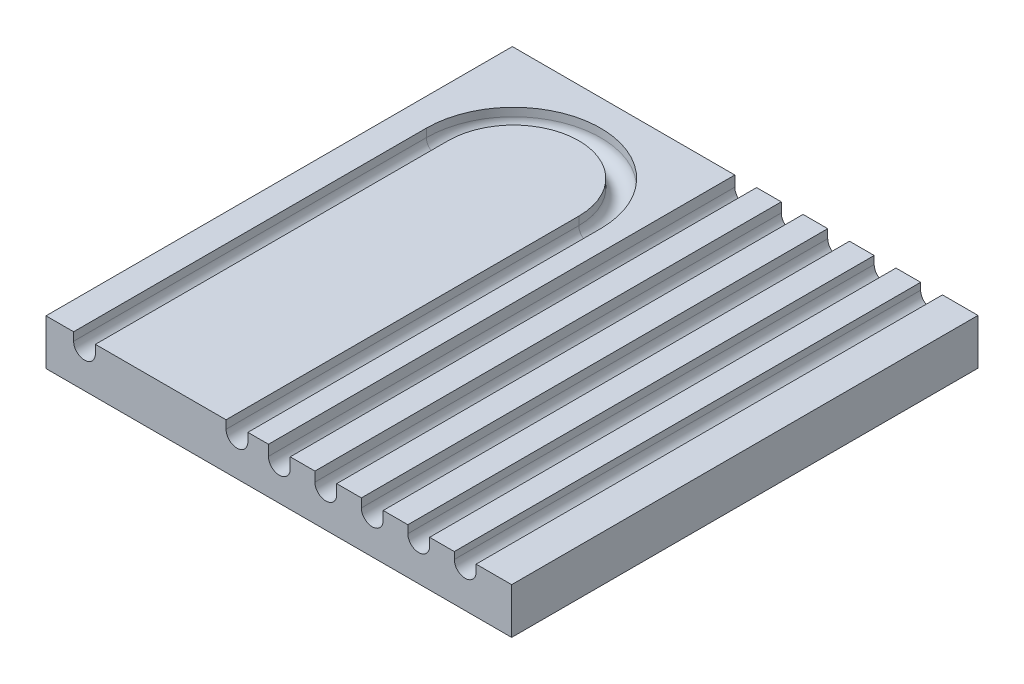
ISO-10303-21;
HEADER;
FILE_DESCRIPTION(('STEP AP214'),'2;1');
FILE_NAME('part.step','',(''),(''),'','','');
FILE_SCHEMA(('AUTOMOTIVE_DESIGN { 1 0 10303 214 1 1 1 1 }'));
ENDSEC;
DATA;
#1=APPLICATION_CONTEXT('core data for automotive mechanical design processes');
#2=APPLICATION_PROTOCOL_DEFINITION('international standard','automotive_design',2000,#1);
#3=PRODUCT_CONTEXT('',#1,'mechanical');
#4=PRODUCT('Part','Part','',(#3));
#5=PRODUCT_RELATED_PRODUCT_CATEGORY('part','',(#4));
#6=PRODUCT_DEFINITION_FORMATION('','',#4);
#7=PRODUCT_DEFINITION_CONTEXT('part definition',#1,'design');
#8=PRODUCT_DEFINITION('design','',#6,#7);
#9=PRODUCT_DEFINITION_SHAPE('','',#8);
#10=(LENGTH_UNIT() NAMED_UNIT(*) SI_UNIT(.MILLI.,.METRE.));
#11=(NAMED_UNIT(*) PLANE_ANGLE_UNIT() SI_UNIT($,.RADIAN.));
#12=(NAMED_UNIT(*) SI_UNIT($,.STERADIAN.) SOLID_ANGLE_UNIT());
#13=UNCERTAINTY_MEASURE_WITH_UNIT(LENGTH_MEASURE(1.E-05),#10,'distance_accuracy_value','');
#14=(GEOMETRIC_REPRESENTATION_CONTEXT(3) GLOBAL_UNCERTAINTY_ASSIGNED_CONTEXT((#13)) GLOBAL_UNIT_ASSIGNED_CONTEXT((#10,
#11,#12)) REPRESENTATION_CONTEXT('',''));
#15=CARTESIAN_POINT('',(0.,0.,0.));
#16=DIRECTION('',(0.,0.,1.));
#17=DIRECTION('',(1.,0.,0.));
#18=AXIS2_PLACEMENT_3D('',#15,#16,#17);
#19=CARTESIAN_POINT('',(0.,10.,0.));
#20=DIRECTION('',(0.,1.,0.));
#21=DIRECTION('',(0.,0.,1.));
#22=AXIS2_PLACEMENT_3D('',#19,#20,#21);
#23=PLANE('',#22);
#24=DIRECTION('',(-1.,0.,0.));
#25=VECTOR('',#24,1.);
#26=CARTESIAN_POINT('',(-50.9143,10.,-50.9905));
#27=LINE('',#26,#25);
#28=CARTESIAN_POINT('',(7.89305,10.,-50.9905));
#29=VERTEX_POINT('',#28);
#30=CARTESIAN_POINT('',(2.49555000000001,10.,-50.9905));
#31=VERTEX_POINT('',#30);
#32=EDGE_CURVE('E262',#29,#31,#27,.T.);
#33=ORIENTED_EDGE('',*,*,#32,.T.);
#34=DIRECTION('',(0.,0.,1.));
#35=VECTOR('',#34,1.);
#36=CARTESIAN_POINT('',(2.49555,10.,-55.9905));
#37=LINE('',#36,#35);
#38=CARTESIAN_POINT('',(2.49555000000001,10.,50.9905));
#39=VERTEX_POINT('',#38);
#40=EDGE_CURVE('E249',#31,#39,#37,.T.);
#41=ORIENTED_EDGE('',*,*,#40,.T.);
#42=DIRECTION('',(1.,0.,0.));
#43=VECTOR('',#42,1.);
#44=CARTESIAN_POINT('',(-50.9143,10.,50.9905));
#45=LINE('',#44,#43);
#46=CARTESIAN_POINT('',(7.89305000000001,10.,50.9905));
#47=VERTEX_POINT('',#46);
#48=EDGE_CURVE('E259',#39,#47,#45,.T.);
#49=ORIENTED_EDGE('',*,*,#48,.T.);
#50=DIRECTION('',(0.,0.,1.));
#51=VECTOR('',#50,1.);
#52=CARTESIAN_POINT('',(7.89305,10.,-55.9905000000001));
#53=LINE('',#52,#51);
#54=EDGE_CURVE('E445',#29,#47,#53,.T.);
#55=ORIENTED_EDGE('',*,*,#54,.F.);
#56=EDGE_LOOP('',(#33,#41,#49,#55));
#57=FACE_BOUND('',#56,.T.);
#58=ADVANCED_FACE('F38',(#57),#23,.T.);
#59=CARTESIAN_POINT('',(-50.9143,10.,50.9905));
#60=DIRECTION('',(0.,0.,-1.));
#61=DIRECTION('',(-1.,0.,0.));
#62=AXIS2_PLACEMENT_3D('',#59,#60,#61);
#63=PLANE('',#62);
#64=DIRECTION('',(0.,-1.,0.));
#65=VECTOR('',#64,1.);
#66=CARTESIAN_POINT('',(-2.26694999999999,7.69999999999999,50.9905));
#67=LINE('',#66,#65);
#68=CARTESIAN_POINT('',(-2.26695,9.99999999999999,50.9905));
#69=VERTEX_POINT('',#68);
#70=CARTESIAN_POINT('',(-2.26694999999999,7.7,50.9905));
#71=VERTEX_POINT('',#70);
#72=EDGE_CURVE('E515',#69,#71,#67,.T.);
#73=ORIENTED_EDGE('',*,*,#72,.F.);
#74=CARTESIAN_POINT('',(-6.7748071279965,9.99999999999999,50.9905));
#75=VERTEX_POINT('',#74);
#76=EDGE_CURVE('E270',#75,#69,#45,.T.);
#77=ORIENTED_EDGE('',*,*,#76,.F.);
#78=DIRECTION('',(0.,1.,0.));
#79=VECTOR('',#78,1.);
#80=CARTESIAN_POINT('',(-6.7748071279965,8.2,50.9905));
#81=LINE('',#80,#79);
#82=CARTESIAN_POINT('',(-6.7748071279965,8.2,50.9905));
#83=VERTEX_POINT('',#82);
#84=EDGE_CURVE('E311',#83,#75,#81,.T.);
#85=ORIENTED_EDGE('',*,*,#84,.F.);
#86=CARTESIAN_POINT('',(-9.1560571279965,8.2,50.9905));
#87=DIRECTION('',(0.,0.,-1.));
#88=DIRECTION('',(-1.,0.,0.));
#89=AXIS2_PLACEMENT_3D('',#86,#87,#88);
#90=CIRCLE('',#89,2.38125);
#91=CARTESIAN_POINT('',(-11.5373071279965,8.2,50.9905));
#92=VERTEX_POINT('',#91);
#93=EDGE_CURVE('E307',#92,#83,#90,.F.);
#94=ORIENTED_EDGE('',*,*,#93,.F.);
#95=DIRECTION('',(0.,-1.,0.));
#96=VECTOR('',#95,1.);
#97=CARTESIAN_POINT('',(-11.5373071279965,9.99999999999999,50.9905));
#98=LINE('',#97,#96);
#99=CARTESIAN_POINT('',(-11.5373071279965,9.99999999999999,50.9905));
#100=VERTEX_POINT('',#99);
#101=EDGE_CURVE('E305',#100,#92,#98,.T.);
#102=ORIENTED_EDGE('',*,*,#101,.F.);
#103=CARTESIAN_POINT('',(-40.1123071279965,9.99999999999999,50.9905));
#104=VERTEX_POINT('',#103);
#105=EDGE_CURVE('E276',#104,#100,#45,.T.);
#106=ORIENTED_EDGE('',*,*,#105,.F.);
#107=DIRECTION('',(0.,1.,0.));
#108=VECTOR('',#107,1.);
#109=CARTESIAN_POINT('',(-40.1123071279965,9.99999999999999,50.9905));
#110=LINE('',#109,#108);
#111=CARTESIAN_POINT('',(-40.1123071279965,8.19999999999999,50.9905));
#112=VERTEX_POINT('',#111);
#113=EDGE_CURVE('E303',#112,#104,#110,.T.);
#114=ORIENTED_EDGE('',*,*,#113,.F.);
#115=CARTESIAN_POINT('',(-42.4935571279965,8.19999999999999,50.9905));
#116=DIRECTION('',(0.,0.,-1.));
#117=DIRECTION('',(-1.,0.,0.));
#118=AXIS2_PLACEMENT_3D('',#115,#116,#117);
#119=CIRCLE('',#118,2.38125);
#120=CARTESIAN_POINT('',(-44.8748071279965,8.19999999999999,50.9905));
#121=VERTEX_POINT('',#120);
#122=EDGE_CURVE('E313',#121,#112,#119,.F.);
#123=ORIENTED_EDGE('',*,*,#122,.F.);
#124=DIRECTION('',(0.,-1.,0.));
#125=VECTOR('',#124,1.);
#126=CARTESIAN_POINT('',(-44.8748071279965,8.19999999999999,50.9905));
#127=LINE('',#126,#125);
#128=CARTESIAN_POINT('',(-44.8748071279965,9.99999999999999,50.9905));
#129=VERTEX_POINT('',#128);
#130=EDGE_CURVE('E342',#129,#121,#127,.T.);
#131=ORIENTED_EDGE('',*,*,#130,.F.);
#132=CARTESIAN_POINT('',(-50.9143,10.,50.9905));
#133=VERTEX_POINT('',#132);
#134=EDGE_CURVE('E274',#133,#129,#45,.T.);
#135=ORIENTED_EDGE('',*,*,#134,.F.);
#136=DIRECTION('',(0.,-1.,0.));
#137=VECTOR('',#136,1.);
#138=CARTESIAN_POINT('',(-50.9143,10.,50.9905));
#139=LINE('',#138,#137);
#140=CARTESIAN_POINT('',(-50.9143,0.,50.9905));
#141=VERTEX_POINT('',#140);
#142=EDGE_CURVE('E288',#133,#141,#139,.T.);
#143=ORIENTED_EDGE('',*,*,#142,.T.);
#144=DIRECTION('',(1.,0.,0.));
#145=VECTOR('',#144,1.);
#146=CARTESIAN_POINT('',(-50.9143,0.,50.9905));
#147=LINE('',#146,#145);
#148=CARTESIAN_POINT('',(50.9143,0.,50.9905));
#149=VERTEX_POINT('',#148);
#150=EDGE_CURVE('E321',#141,#149,#147,.T.);
#151=ORIENTED_EDGE('',*,*,#150,.T.);
#152=DIRECTION('',(0.,-1.,0.));
#153=VECTOR('',#152,1.);
#154=CARTESIAN_POINT('',(50.9143,10.,50.9905));
#155=LINE('',#154,#153);
#156=CARTESIAN_POINT('',(50.9143,10.,50.9905));
#157=VERTEX_POINT('',#156);
#158=EDGE_CURVE('E283',#157,#149,#155,.T.);
#159=ORIENTED_EDGE('',*,*,#158,.F.);
#160=CARTESIAN_POINT('',(43.13555,10.,50.9905));
#161=VERTEX_POINT('',#160);
#162=EDGE_CURVE('E273',#161,#157,#45,.T.);
#163=ORIENTED_EDGE('',*,*,#162,.F.);
#164=DIRECTION('',(0.,1.,0.));
#165=VECTOR('',#164,1.);
#166=CARTESIAN_POINT('',(43.13555,10.,50.9905));
#167=LINE('',#166,#165);
#168=CARTESIAN_POINT('',(43.13555,8.5,50.9905));
#169=VERTEX_POINT('',#168);
#170=EDGE_CURVE('E413',#169,#161,#167,.T.);
#171=ORIENTED_EDGE('',*,*,#170,.F.);
#172=CARTESIAN_POINT('',(40.7543,8.5,50.9905));
#173=DIRECTION('',(0.,0.,-1.));
#174=DIRECTION('',(-1.,0.,0.));
#175=AXIS2_PLACEMENT_3D('',#172,#173,#174);
#176=CIRCLE('',#175,2.38125);
#177=CARTESIAN_POINT('',(38.37305,8.5,50.9905));
#178=VERTEX_POINT('',#177);
#179=EDGE_CURVE('E415',#178,#169,#176,.F.);
#180=ORIENTED_EDGE('',*,*,#179,.F.);
#181=DIRECTION('',(0.,-1.,0.));
#182=VECTOR('',#181,1.);
#183=CARTESIAN_POINT('',(38.37305,8.5,50.9905));
#184=LINE('',#183,#182);
#185=CARTESIAN_POINT('',(38.37305,10.,50.9905));
#186=VERTEX_POINT('',#185);
#187=EDGE_CURVE('E418',#186,#178,#184,.T.);
#188=ORIENTED_EDGE('',*,*,#187,.F.);
#189=CARTESIAN_POINT('',(32.97555,10.,50.9905));
#190=VERTEX_POINT('',#189);
#191=EDGE_CURVE('E278',#190,#186,#45,.T.);
#192=ORIENTED_EDGE('',*,*,#191,.F.);
#193=DIRECTION('',(0.,1.,0.));
#194=VECTOR('',#193,1.);
#195=CARTESIAN_POINT('',(32.97555,10.,50.9905));
#196=LINE('',#195,#194);
#197=CARTESIAN_POINT('',(32.97555,8.3,50.9905));
#198=VERTEX_POINT('',#197);
#199=EDGE_CURVE('E466',#198,#190,#196,.T.);
#200=ORIENTED_EDGE('',*,*,#199,.F.);
#201=CARTESIAN_POINT('',(30.5943,8.3,50.9905));
#202=DIRECTION('',(0.,0.,-1.));
#203=DIRECTION('',(-1.,0.,0.));
#204=AXIS2_PLACEMENT_3D('',#201,#202,#203);
#205=CIRCLE('',#204,2.38125);
#206=CARTESIAN_POINT('',(28.21305,8.3,50.9905));
#207=VERTEX_POINT('',#206);
#208=EDGE_CURVE('E468',#207,#198,#205,.F.);
#209=ORIENTED_EDGE('',*,*,#208,.F.);
#210=DIRECTION('',(0.,-1.,0.));
#211=VECTOR('',#210,1.);
#212=CARTESIAN_POINT('',(28.21305,8.3,50.9905));
#213=LINE('',#212,#211);
#214=CARTESIAN_POINT('',(28.21305,10.,50.9905));
#215=VERTEX_POINT('',#214);
#216=EDGE_CURVE('E461',#215,#207,#213,.T.);
#217=ORIENTED_EDGE('',*,*,#216,.F.);
#218=CARTESIAN_POINT('',(22.81555,10.,50.9905));
#219=VERTEX_POINT('',#218);
#220=EDGE_CURVE('E277',#219,#215,#45,.T.);
#221=ORIENTED_EDGE('',*,*,#220,.F.);
#222=DIRECTION('',(0.,1.,0.));
#223=VECTOR('',#222,1.);
#224=CARTESIAN_POINT('',(22.81555,8.1,50.9905));
#225=LINE('',#224,#223);
#226=CARTESIAN_POINT('',(22.81555,8.1,50.9905));
#227=VERTEX_POINT('',#226);
#228=EDGE_CURVE('E484',#227,#219,#225,.T.);
#229=ORIENTED_EDGE('',*,*,#228,.F.);
#230=CARTESIAN_POINT('',(20.4343,8.1,50.9905));
#231=DIRECTION('',(0.,0.,-1.));
#232=DIRECTION('',(-1.,0.,0.));
#233=AXIS2_PLACEMENT_3D('',#230,#231,#232);
#234=CIRCLE('',#233,2.38125);
#235=CARTESIAN_POINT('',(18.05305,8.1,50.9905));
#236=VERTEX_POINT('',#235);
#237=EDGE_CURVE('E486',#236,#227,#234,.F.);
#238=ORIENTED_EDGE('',*,*,#237,.F.);
#239=DIRECTION('',(0.,-1.,0.));
#240=VECTOR('',#239,1.);
#241=CARTESIAN_POINT('',(18.05305,8.1,50.9905));
#242=LINE('',#241,#240);
#243=CARTESIAN_POINT('',(18.05305,10.,50.9905));
#244=VERTEX_POINT('',#243);
#245=EDGE_CURVE('E489',#244,#236,#242,.T.);
#246=ORIENTED_EDGE('',*,*,#245,.F.);
#247=CARTESIAN_POINT('',(12.65555,10.,50.9905));
#248=VERTEX_POINT('',#247);
#249=EDGE_CURVE('E271',#248,#244,#45,.T.);
#250=ORIENTED_EDGE('',*,*,#249,.F.);
#251=DIRECTION('',(0.,1.,0.));
#252=VECTOR('',#251,1.);
#253=CARTESIAN_POINT('',(12.65555,7.9,50.9905));
#254=LINE('',#253,#252);
#255=CARTESIAN_POINT('',(12.65555,7.9,50.9905));
#256=VERTEX_POINT('',#255);
#257=EDGE_CURVE('E437',#256,#248,#254,.T.);
#258=ORIENTED_EDGE('',*,*,#257,.F.);
#259=CARTESIAN_POINT('',(10.2743,7.9,50.9905));
#260=DIRECTION('',(0.,0.,-1.));
#261=DIRECTION('',(-1.,0.,0.));
#262=AXIS2_PLACEMENT_3D('',#259,#260,#261);
#263=CIRCLE('',#262,2.38125);
#264=CARTESIAN_POINT('',(7.89305000000001,7.9,50.9905));
#265=VERTEX_POINT('',#264);
#266=EDGE_CURVE('E440',#265,#256,#263,.F.);
#267=ORIENTED_EDGE('',*,*,#266,.F.);
#268=DIRECTION('',(0.,-1.,0.));
#269=VECTOR('',#268,1.);
#270=CARTESIAN_POINT('',(7.89305000000001,10.,50.9905));
#271=LINE('',#270,#269);
#272=EDGE_CURVE('E269',#47,#265,#271,.T.);
#273=ORIENTED_EDGE('',*,*,#272,.F.);
#274=ORIENTED_EDGE('',*,*,#48,.F.);
#275=DIRECTION('',(0.,1.,0.));
#276=VECTOR('',#275,1.);
#277=CARTESIAN_POINT('',(2.49555000000001,10.,50.9905));
#278=LINE('',#277,#276);
#279=CARTESIAN_POINT('',(2.49555000000001,7.7,50.9905));
#280=VERTEX_POINT('',#279);
#281=EDGE_CURVE('E246',#280,#39,#278,.T.);
#282=ORIENTED_EDGE('',*,*,#281,.F.);
#283=CARTESIAN_POINT('',(0.114300000000012,7.7,50.9905));
#284=DIRECTION('',(0.,0.,-1.));
#285=DIRECTION('',(-1.,0.,0.));
#286=AXIS2_PLACEMENT_3D('',#283,#284,#285);
#287=CIRCLE('',#286,2.38125);
#288=EDGE_CURVE('E254',#71,#280,#287,.F.);
#289=ORIENTED_EDGE('',*,*,#288,.F.);
#290=EDGE_LOOP('',(#73,#77,#85,#94,#102,#106,#114,#123,#131,#135,#143,#151,#159,#163,#171,#180,
#188,#192,#200,#209,#217,#221,#229,#238,#246,#250,#258,#267,#273,#274,#282,#289));
#291=FACE_BOUND('',#290,.T.);
#292=ADVANCED_FACE('F266',(#291),#63,.F.);
#293=CARTESIAN_POINT('',(-50.9143,10.,-50.9905));
#294=DIRECTION('',(0.,0.,1.));
#295=DIRECTION('',(1.,0.,0.));
#296=AXIS2_PLACEMENT_3D('',#293,#294,#295);
#297=PLANE('',#296);
#298=DIRECTION('',(0.,1.,0.));
#299=VECTOR('',#298,1.);
#300=CARTESIAN_POINT('',(-2.26695,7.69999999999999,-50.9905));
#301=LINE('',#300,#299);
#302=CARTESIAN_POINT('',(-2.26695,7.69999999999999,-50.9905));
#303=VERTEX_POINT('',#302);
#304=CARTESIAN_POINT('',(-2.26695,9.99999999999999,-50.9905));
#305=VERTEX_POINT('',#304);
#306=EDGE_CURVE('E432',#303,#305,#301,.T.);
#307=ORIENTED_EDGE('',*,*,#306,.F.);
#308=CARTESIAN_POINT('',(0.114299999999998,7.7,-50.9905));
#309=DIRECTION('',(0.,0.,1.));
#310=DIRECTION('',(1.,0.,0.));
#311=AXIS2_PLACEMENT_3D('',#308,#309,#310);
#312=CIRCLE('',#311,2.38125);
#313=CARTESIAN_POINT('',(2.49555,7.7,-50.9905));
#314=VERTEX_POINT('',#313);
#315=EDGE_CURVE('E520',#314,#303,#312,.F.);
#316=ORIENTED_EDGE('',*,*,#315,.F.);
#317=DIRECTION('',(0.,-1.,0.));
#318=VECTOR('',#317,1.);
#319=CARTESIAN_POINT('',(2.49555,10.,-50.9905));
#320=LINE('',#319,#318);
#321=EDGE_CURVE('E518',#31,#314,#320,.T.);
#322=ORIENTED_EDGE('',*,*,#321,.F.);
#323=ORIENTED_EDGE('',*,*,#32,.F.);
#324=DIRECTION('',(0.,1.,0.));
#325=VECTOR('',#324,1.);
#326=CARTESIAN_POINT('',(7.89305,10.,-50.9905));
#327=LINE('',#326,#325);
#328=CARTESIAN_POINT('',(7.89305,7.9,-50.9905));
#329=VERTEX_POINT('',#328);
#330=EDGE_CURVE('E436',#329,#29,#327,.T.);
#331=ORIENTED_EDGE('',*,*,#330,.F.);
#332=CARTESIAN_POINT('',(10.2743,7.9,-50.9905));
#333=DIRECTION('',(0.,0.,1.));
#334=DIRECTION('',(1.,0.,0.));
#335=AXIS2_PLACEMENT_3D('',#332,#333,#334);
#336=CIRCLE('',#335,2.38125);
#337=CARTESIAN_POINT('',(12.65555,7.9,-50.9905));
#338=VERTEX_POINT('',#337);
#339=EDGE_CURVE('E434',#338,#329,#336,.F.);
#340=ORIENTED_EDGE('',*,*,#339,.F.);
#341=DIRECTION('',(0.,-1.,0.));
#342=VECTOR('',#341,1.);
#343=CARTESIAN_POINT('',(12.65555,7.9,-50.9905));
#344=LINE('',#343,#342);
#345=CARTESIAN_POINT('',(12.65555,10.,-50.9905));
#346=VERTEX_POINT('',#345);
#347=EDGE_CURVE('E439',#346,#338,#344,.T.);
#348=ORIENTED_EDGE('',*,*,#347,.F.);
#349=CARTESIAN_POINT('',(18.05305,10.,-50.9905));
#350=VERTEX_POINT('',#349);
#351=EDGE_CURVE('E325',#350,#346,#27,.T.);
#352=ORIENTED_EDGE('',*,*,#351,.F.);
#353=DIRECTION('',(0.,1.,0.));
#354=VECTOR('',#353,1.);
#355=CARTESIAN_POINT('',(18.05305,8.1,-50.9905));
#356=LINE('',#355,#354);
#357=CARTESIAN_POINT('',(18.05305,8.1,-50.9905));
#358=VERTEX_POINT('',#357);
#359=EDGE_CURVE('E483',#358,#350,#356,.T.);
#360=ORIENTED_EDGE('',*,*,#359,.F.);
#361=CARTESIAN_POINT('',(20.4343,8.1,-50.9905));
#362=DIRECTION('',(0.,0.,1.));
#363=DIRECTION('',(1.,0.,0.));
#364=AXIS2_PLACEMENT_3D('',#361,#362,#363);
#365=CIRCLE('',#364,2.38125);
#366=CARTESIAN_POINT('',(22.81555,8.1,-50.9905));
#367=VERTEX_POINT('',#366);
#368=EDGE_CURVE('E481',#367,#358,#365,.F.);
#369=ORIENTED_EDGE('',*,*,#368,.F.);
#370=DIRECTION('',(0.,-1.,0.));
#371=VECTOR('',#370,1.);
#372=CARTESIAN_POINT('',(22.81555,8.1,-50.9905));
#373=LINE('',#372,#371);
#374=CARTESIAN_POINT('',(22.81555,10.,-50.9905));
#375=VERTEX_POINT('',#374);
#376=EDGE_CURVE('E388',#375,#367,#373,.T.);
#377=ORIENTED_EDGE('',*,*,#376,.F.);
#378=CARTESIAN_POINT('',(28.21305,10.,-50.9905));
#379=VERTEX_POINT('',#378);
#380=EDGE_CURVE('E546',#379,#375,#27,.T.);
#381=ORIENTED_EDGE('',*,*,#380,.F.);
#382=DIRECTION('',(0.,1.,0.));
#383=VECTOR('',#382,1.);
#384=CARTESIAN_POINT('',(28.21305,8.3,-50.9905));
#385=LINE('',#384,#383);
#386=CARTESIAN_POINT('',(28.21305,8.3,-50.9905));
#387=VERTEX_POINT('',#386);
#388=EDGE_CURVE('E463',#387,#379,#385,.T.);
#389=ORIENTED_EDGE('',*,*,#388,.F.);
#390=CARTESIAN_POINT('',(30.5943,8.3,-50.9905));
#391=DIRECTION('',(0.,0.,1.));
#392=DIRECTION('',(1.,0.,0.));
#393=AXIS2_PLACEMENT_3D('',#390,#391,#392);
#394=CIRCLE('',#393,2.38125);
#395=CARTESIAN_POINT('',(32.97555,8.3,-50.9905));
#396=VERTEX_POINT('',#395);
#397=EDGE_CURVE('E460',#396,#387,#394,.F.);
#398=ORIENTED_EDGE('',*,*,#397,.F.);
#399=DIRECTION('',(0.,-1.,0.));
#400=VECTOR('',#399,1.);
#401=CARTESIAN_POINT('',(32.97555,10.,-50.9905));
#402=LINE('',#401,#400);
#403=CARTESIAN_POINT('',(32.97555,10.,-50.9905));
#404=VERTEX_POINT('',#403);
#405=EDGE_CURVE('E457',#404,#396,#402,.T.);
#406=ORIENTED_EDGE('',*,*,#405,.F.);
#407=CARTESIAN_POINT('',(38.37305,10.,-50.9905));
#408=VERTEX_POINT('',#407);
#409=EDGE_CURVE('E324',#408,#404,#27,.T.);
#410=ORIENTED_EDGE('',*,*,#409,.F.);
#411=DIRECTION('',(0.,1.,0.));
#412=VECTOR('',#411,1.);
#413=CARTESIAN_POINT('',(38.37305,8.5,-50.9905));
#414=LINE('',#413,#412);
#415=CARTESIAN_POINT('',(38.37305,8.5,-50.9905));
#416=VERTEX_POINT('',#415);
#417=EDGE_CURVE('E422',#416,#408,#414,.T.);
#418=ORIENTED_EDGE('',*,*,#417,.F.);
#419=CARTESIAN_POINT('',(40.7543,8.5,-50.9905));
#420=DIRECTION('',(0.,0.,1.));
#421=DIRECTION('',(1.,0.,0.));
#422=AXIS2_PLACEMENT_3D('',#419,#420,#421);
#423=CIRCLE('',#422,2.38125);
#424=CARTESIAN_POINT('',(43.13555,8.5,-50.9905));
#425=VERTEX_POINT('',#424);
#426=EDGE_CURVE('E529',#425,#416,#423,.F.);
#427=ORIENTED_EDGE('',*,*,#426,.F.);
#428=DIRECTION('',(0.,-1.,0.));
#429=VECTOR('',#428,1.);
#430=CARTESIAN_POINT('',(43.13555,10.,-50.9905));
#431=LINE('',#430,#429);
#432=CARTESIAN_POINT('',(43.13555,10.,-50.9905));
#433=VERTEX_POINT('',#432);
#434=EDGE_CURVE('E427',#433,#425,#431,.T.);
#435=ORIENTED_EDGE('',*,*,#434,.F.);
#436=CARTESIAN_POINT('',(50.9143,10.,-50.9905));
#437=VERTEX_POINT('',#436);
#438=EDGE_CURVE('E322',#437,#433,#27,.T.);
#439=ORIENTED_EDGE('',*,*,#438,.F.);
#440=DIRECTION('',(0.,-1.,0.));
#441=VECTOR('',#440,1.);
#442=CARTESIAN_POINT('',(50.9143,10.,-50.9905));
#443=LINE('',#442,#441);
#444=CARTESIAN_POINT('',(50.9143,0.,-50.9905));
#445=VERTEX_POINT('',#444);
#446=EDGE_CURVE('E11',#437,#445,#443,.T.);
#447=ORIENTED_EDGE('',*,*,#446,.T.);
#448=DIRECTION('',(-1.,0.,0.));
#449=VECTOR('',#448,1.);
#450=CARTESIAN_POINT('',(-50.9143,0.,-50.9905));
#451=LINE('',#450,#449);
#452=CARTESIAN_POINT('',(-50.9143,0.,-50.9905));
#453=VERTEX_POINT('',#452);
#454=EDGE_CURVE('E394',#445,#453,#451,.T.);
#455=ORIENTED_EDGE('',*,*,#454,.T.);
#456=DIRECTION('',(0.,-1.,0.));
#457=VECTOR('',#456,1.);
#458=CARTESIAN_POINT('',(-50.9143,10.,-50.9905));
#459=LINE('',#458,#457);
#460=CARTESIAN_POINT('',(-50.9143,10.,-50.9905));
#461=VERTEX_POINT('',#460);
#462=EDGE_CURVE('E46',#461,#453,#459,.T.);
#463=ORIENTED_EDGE('',*,*,#462,.F.);
#464=EDGE_CURVE('E320',#305,#461,#27,.T.);
#465=ORIENTED_EDGE('',*,*,#464,.F.);
#466=EDGE_LOOP('',(#307,#316,#322,#323,#331,#340,#348,#352,#360,#369,#377,#381,#389,#398,#406,
#410,#418,#427,#435,#439,#447,#455,#463,#465));
#467=FACE_BOUND('',#466,.T.);
#468=ADVANCED_FACE('F544',(#467),#297,.F.);
#469=ORIENTED_EDGE('',*,*,#438,.T.);
#470=DIRECTION('',(0.,0.,1.));
#471=VECTOR('',#470,1.);
#472=CARTESIAN_POINT('',(43.13555,10.,-54.9905000000001));
#473=LINE('',#472,#471);
#474=EDGE_CURVE('E410',#433,#161,#473,.T.);
#475=ORIENTED_EDGE('',*,*,#474,.T.);
#476=ORIENTED_EDGE('',*,*,#162,.T.);
#477=DIRECTION('',(0.,0.,-1.));
#478=VECTOR('',#477,1.);
#479=CARTESIAN_POINT('',(50.9143,10.,-50.9905));
#480=LINE('',#479,#478);
#481=EDGE_CURVE('E317',#157,#437,#480,.T.);
#482=ORIENTED_EDGE('',*,*,#481,.T.);
#483=EDGE_LOOP('',(#469,#475,#476,#482));
#484=FACE_BOUND('',#483,.T.);
#485=ADVANCED_FACE('F408',(#484),#23,.T.);
#486=ORIENTED_EDGE('',*,*,#351,.T.);
#487=DIRECTION('',(0.,0.,1.));
#488=VECTOR('',#487,1.);
#489=CARTESIAN_POINT('',(12.65555,10.,-55.9905000000001));
#490=LINE('',#489,#488);
#491=EDGE_CURVE('E448',#346,#248,#490,.T.);
#492=ORIENTED_EDGE('',*,*,#491,.T.);
#493=ORIENTED_EDGE('',*,*,#249,.T.);
#494=DIRECTION('',(0.,0.,1.));
#495=VECTOR('',#494,1.);
#496=CARTESIAN_POINT('',(18.05305,10.,-51.9905));
#497=LINE('',#496,#495);
#498=EDGE_CURVE('E493',#350,#244,#497,.T.);
#499=ORIENTED_EDGE('',*,*,#498,.F.);
#500=EDGE_LOOP('',(#486,#492,#493,#499));
#501=FACE_BOUND('',#500,.T.);
#502=ADVANCED_FACE('F551',(#501),#23,.T.);
#503=DIRECTION('',(0.,0.,1.));
#504=VECTOR('',#503,1.);
#505=CARTESIAN_POINT('',(38.37305,10.,-54.9905000000001));
#506=LINE('',#505,#504);
#507=EDGE_CURVE('E430',#408,#186,#506,.T.);
#508=ORIENTED_EDGE('',*,*,#507,.F.);
#509=ORIENTED_EDGE('',*,*,#409,.T.);
#510=DIRECTION('',(0.,0.,1.));
#511=VECTOR('',#510,1.);
#512=CARTESIAN_POINT('',(32.97555,10.,-51.9905));
#513=LINE('',#512,#511);
#514=EDGE_CURVE('E469',#404,#190,#513,.T.);
#515=ORIENTED_EDGE('',*,*,#514,.T.);
#516=ORIENTED_EDGE('',*,*,#191,.T.);
#517=EDGE_LOOP('',(#508,#509,#515,#516));
#518=FACE_BOUND('',#517,.T.);
#519=ADVANCED_FACE('F539',(#518),#23,.T.);
#520=DIRECTION('',(0.,0.,1.));
#521=VECTOR('',#520,1.);
#522=CARTESIAN_POINT('',(28.21305,10.,-51.9905));
#523=LINE('',#522,#521);
#524=EDGE_CURVE('E456',#379,#215,#523,.T.);
#525=ORIENTED_EDGE('',*,*,#524,.F.);
#526=ORIENTED_EDGE('',*,*,#380,.T.);
#527=DIRECTION('',(0.,0.,1.));
#528=VECTOR('',#527,1.);
#529=CARTESIAN_POINT('',(22.81555,10.,-51.9905));
#530=LINE('',#529,#528);
#531=EDGE_CURVE('E465',#375,#219,#530,.T.);
#532=ORIENTED_EDGE('',*,*,#531,.T.);
#533=ORIENTED_EDGE('',*,*,#220,.T.);
#534=EDGE_LOOP('',(#525,#526,#532,#533));
#535=FACE_BOUND('',#534,.T.);
#536=ADVANCED_FACE('F579',(#535),#23,.T.);
#537=DIRECTION('',(0.,0.,1.));
#538=VECTOR('',#537,1.);
#539=CARTESIAN_POINT('',(-2.26695,9.99999999999999,-55.9905));
#540=LINE('',#539,#538);
#541=EDGE_CURVE('E526',#305,#69,#540,.T.);
#542=ORIENTED_EDGE('',*,*,#541,.F.);
#543=ORIENTED_EDGE('',*,*,#464,.T.);
#544=DIRECTION('',(0.,0.,1.));
#545=VECTOR('',#544,1.);
#546=CARTESIAN_POINT('',(-50.9143,10.,-50.9905));
#547=LINE('',#546,#545);
#548=EDGE_CURVE('E281',#461,#133,#547,.T.);
#549=ORIENTED_EDGE('',*,*,#548,.T.);
#550=ORIENTED_EDGE('',*,*,#134,.T.);
#551=DIRECTION('',(0.,0.,1.));
#552=VECTOR('',#551,1.);
#553=CARTESIAN_POINT('',(-44.8748071279965,9.99999999999999,-26.1496508476853));
#554=LINE('',#553,#552);
#555=CARTESIAN_POINT('',(-44.8748071279965,9.99999999999999,-26.1496508476853));
#556=VERTEX_POINT('',#555);
#557=EDGE_CURVE('E359',#556,#129,#554,.T.);
#558=ORIENTED_EDGE('',*,*,#557,.F.);
#559=CARTESIAN_POINT('',(-25.8248071279965,9.99999999999999,-26.1496508476853));
#560=DIRECTION('',(0.,1.,0.));
#561=DIRECTION('',(1.,0.,0.));
#562=AXIS2_PLACEMENT_3D('',#559,#560,#561);
#563=CIRCLE('',#562,19.05);
#564=CARTESIAN_POINT('',(-6.77480712799651,9.99999999999999,-26.1496508476853));
#565=VERTEX_POINT('',#564);
#566=EDGE_CURVE('E353',#565,#556,#563,.T.);
#567=ORIENTED_EDGE('',*,*,#566,.F.);
#568=DIRECTION('',(0.,0.,-1.));
#569=VECTOR('',#568,1.);
#570=CARTESIAN_POINT('',(-6.7748071279965,9.99999999999999,51.9905));
#571=LINE('',#570,#569);
#572=EDGE_CURVE('E387',#75,#565,#571,.T.);
#573=ORIENTED_EDGE('',*,*,#572,.F.);
#574=ORIENTED_EDGE('',*,*,#76,.T.);
#575=EDGE_LOOP('',(#542,#543,#549,#550,#558,#567,#573,#574));
#576=FACE_BOUND('',#575,.T.);
#577=ADVANCED_FACE('F329',(#576),#23,.T.);
#578=ORIENTED_EDGE('',*,*,#105,.T.);
#579=DIRECTION('',(0.,0.,-1.));
#580=VECTOR('',#579,1.);
#581=CARTESIAN_POINT('',(-11.5373071279965,9.99999999999999,51.9905));
#582=LINE('',#581,#580);
#583=CARTESIAN_POINT('',(-11.5373071279965,9.99999999999999,-26.1496508476853));
#584=VERTEX_POINT('',#583);
#585=EDGE_CURVE('E297',#100,#584,#582,.T.);
#586=ORIENTED_EDGE('',*,*,#585,.T.);
#587=CARTESIAN_POINT('',(-25.8248071279965,9.99999999999999,-26.1496508476853));
#588=DIRECTION('',(0.,1.,0.));
#589=DIRECTION('',(1.,0.,0.));
#590=AXIS2_PLACEMENT_3D('',#587,#588,#589);
#591=CIRCLE('',#590,14.2875);
#592=CARTESIAN_POINT('',(-40.1123071279965,10.,-26.1496508476853));
#593=VERTEX_POINT('',#592);
#594=EDGE_CURVE('E357',#584,#593,#591,.T.);
#595=ORIENTED_EDGE('',*,*,#594,.T.);
#596=DIRECTION('',(0.,0.,1.));
#597=VECTOR('',#596,1.);
#598=CARTESIAN_POINT('',(-40.1123071279965,9.99999999999999,-26.1496508476853));
#599=LINE('',#598,#597);
#600=EDGE_CURVE('E299',#593,#104,#599,.T.);
#601=ORIENTED_EDGE('',*,*,#600,.T.);
#602=EDGE_LOOP('',(#578,#586,#595,#601));
#603=FACE_BOUND('',#602,.T.);
#604=ADVANCED_FACE('F295',(#603),#23,.T.);
#605=CARTESIAN_POINT('',(50.9143,10.,-50.9905));
#606=DIRECTION('',(-1.,0.,0.));
#607=DIRECTION('',(0.,0.,1.));
#608=AXIS2_PLACEMENT_3D('',#605,#606,#607);
#609=PLANE('',#608);
#610=DIRECTION('',(0.,0.,-1.));
#611=VECTOR('',#610,1.);
#612=CARTESIAN_POINT('',(50.9143,0.,-50.9905));
#613=LINE('',#612,#611);
#614=EDGE_CURVE('E389',#149,#445,#613,.T.);
#615=ORIENTED_EDGE('',*,*,#614,.T.);
#616=ORIENTED_EDGE('',*,*,#446,.F.);
#617=ORIENTED_EDGE('',*,*,#481,.F.);
#618=ORIENTED_EDGE('',*,*,#158,.T.);
#619=EDGE_LOOP('',(#615,#616,#617,#618));
#620=FACE_BOUND('',#619,.T.);
#621=ADVANCED_FACE('F40',(#620),#609,.F.);
#622=CARTESIAN_POINT('',(-50.9143,10.,-50.9905));
#623=DIRECTION('',(1.,0.,0.));
#624=DIRECTION('',(0.,0.,-1.));
#625=AXIS2_PLACEMENT_3D('',#622,#623,#624);
#626=PLANE('',#625);
#627=DIRECTION('',(0.,0.,1.));
#628=VECTOR('',#627,1.);
#629=CARTESIAN_POINT('',(-50.9143,0.,-50.9905));
#630=LINE('',#629,#628);
#631=EDGE_CURVE('E337',#453,#141,#630,.T.);
#632=ORIENTED_EDGE('',*,*,#631,.T.);
#633=ORIENTED_EDGE('',*,*,#142,.F.);
#634=ORIENTED_EDGE('',*,*,#548,.F.);
#635=ORIENTED_EDGE('',*,*,#462,.T.);
#636=EDGE_LOOP('',(#632,#633,#634,#635));
#637=FACE_BOUND('',#636,.T.);
#638=ADVANCED_FACE('F335',(#637),#626,.F.);
#639=CARTESIAN_POINT('',(0.,0.,0.));
#640=DIRECTION('',(0.,1.,0.));
#641=DIRECTION('',(0.,0.,1.));
#642=AXIS2_PLACEMENT_3D('',#639,#640,#641);
#643=PLANE('',#642);
#644=ORIENTED_EDGE('',*,*,#614,.F.);
#645=ORIENTED_EDGE('',*,*,#150,.F.);
#646=ORIENTED_EDGE('',*,*,#631,.F.);
#647=ORIENTED_EDGE('',*,*,#454,.F.);
#648=EDGE_LOOP('',(#644,#645,#646,#647));
#649=FACE_BOUND('',#648,.T.);
#650=ADVANCED_FACE('F403',(#649),#643,.F.);
#651=CARTESIAN_POINT('',(-6.7748071279965,8.2,51.9905));
#652=DIRECTION('',(1.,0.,0.));
#653=DIRECTION('',(0.,0.,-1.));
#654=AXIS2_PLACEMENT_3D('',#651,#652,#653);
#655=PLANE('',#654);
#656=ORIENTED_EDGE('',*,*,#84,.T.);
#657=ORIENTED_EDGE('',*,*,#572,.T.);
#658=DIRECTION('',(0.,-1.,0.));
#659=VECTOR('',#658,1.);
#660=CARTESIAN_POINT('',(-6.77480712799651,8.2,-26.1496508476853));
#661=LINE('',#660,#659);
#662=CARTESIAN_POINT('',(-6.77480712799651,8.2,-26.1496508476853));
#663=VERTEX_POINT('',#662);
#664=EDGE_CURVE('E361',#565,#663,#661,.T.);
#665=ORIENTED_EDGE('',*,*,#664,.T.);
#666=DIRECTION('',(0.,0.,-1.));
#667=VECTOR('',#666,1.);
#668=CARTESIAN_POINT('',(-6.7748071279965,8.2,51.9905));
#669=LINE('',#668,#667);
#670=EDGE_CURVE('E385',#83,#663,#669,.T.);
#671=ORIENTED_EDGE('',*,*,#670,.F.);
#672=EDGE_LOOP('',(#656,#657,#665,#671));
#673=FACE_BOUND('',#672,.T.);
#674=ADVANCED_FACE('F668',(#673),#655,.F.);
#675=CARTESIAN_POINT('',(-9.1560571279965,8.2,51.9905));
#676=DIRECTION('',(0.,0.,-1.));
#677=DIRECTION('',(-1.,0.,0.));
#678=AXIS2_PLACEMENT_3D('',#675,#676,#677);
#679=CYLINDRICAL_SURFACE('',#678,2.38125);
#680=ORIENTED_EDGE('',*,*,#93,.T.);
#681=ORIENTED_EDGE('',*,*,#670,.T.);
#682=CARTESIAN_POINT('',(-9.15605712799651,8.2,-26.1496508476853));
#683=DIRECTION('',(0.,0.,-1.));
#684=DIRECTION('',(1.,0.,0.));
#685=AXIS2_PLACEMENT_3D('',#682,#683,#684);
#686=CIRCLE('',#685,2.38125);
#687=CARTESIAN_POINT('',(-11.5373071279965,8.2,-26.1496508476853));
#688=VERTEX_POINT('',#687);
#689=EDGE_CURVE('E371',#663,#688,#686,.T.);
#690=ORIENTED_EDGE('',*,*,#689,.T.);
#691=DIRECTION('',(0.,0.,-1.));
#692=VECTOR('',#691,1.);
#693=CARTESIAN_POINT('',(-11.5373071279965,8.2,51.9905));
#694=LINE('',#693,#692);
#695=EDGE_CURVE('E383',#92,#688,#694,.T.);
#696=ORIENTED_EDGE('',*,*,#695,.F.);
#697=EDGE_LOOP('',(#680,#681,#690,#696));
#698=FACE_BOUND('',#697,.T.);
#699=ADVANCED_FACE('F772',(#698),#679,.F.);
#700=CARTESIAN_POINT('',(-11.5373071279965,9.99999999999999,51.9905));
#701=DIRECTION('',(-1.,0.,0.));
#702=DIRECTION('',(0.,0.,1.));
#703=AXIS2_PLACEMENT_3D('',#700,#701,#702);
#704=PLANE('',#703);
#705=ORIENTED_EDGE('',*,*,#101,.T.);
#706=ORIENTED_EDGE('',*,*,#695,.T.);
#707=DIRECTION('',(0.,1.,0.));
#708=VECTOR('',#707,1.);
#709=CARTESIAN_POINT('',(-11.5373071279965,9.99999999999999,-26.1496508476853));
#710=LINE('',#709,#708);
#711=EDGE_CURVE('E360',#688,#584,#710,.T.);
#712=ORIENTED_EDGE('',*,*,#711,.T.);
#713=ORIENTED_EDGE('',*,*,#585,.F.);
#714=EDGE_LOOP('',(#705,#706,#712,#713));
#715=FACE_BOUND('',#714,.T.);
#716=ADVANCED_FACE('F776',(#715),#704,.F.);
#717=CARTESIAN_POINT('',(-25.8248071279965,10.,-26.1496508476853));
#718=DIRECTION('',(0.,1.,0.));
#719=DIRECTION('',(0.,0.,1.));
#720=AXIS2_PLACEMENT_3D('',#717,#718,#719);
#721=CYLINDRICAL_SURFACE('',#720,19.05);
#722=CARTESIAN_POINT('',(-25.8248071279965,8.2,-26.1496508476853));
#723=DIRECTION('',(0.,1.,0.));
#724=DIRECTION('',(1.,0.,0.));
#725=AXIS2_PLACEMENT_3D('',#722,#723,#724);
#726=CIRCLE('',#725,19.05);
#727=CARTESIAN_POINT('',(-44.8748071279965,8.2,-26.1496508476853));
#728=VERTEX_POINT('',#727);
#729=EDGE_CURVE('E356',#663,#728,#726,.T.);
#730=ORIENTED_EDGE('',*,*,#729,.F.);
#731=ORIENTED_EDGE('',*,*,#664,.F.);
#732=ORIENTED_EDGE('',*,*,#566,.T.);
#733=DIRECTION('',(0.,-1.,0.));
#734=VECTOR('',#733,1.);
#735=CARTESIAN_POINT('',(-44.8748071279965,8.2,-26.1496508476853));
#736=LINE('',#735,#734);
#737=EDGE_CURVE('E365',#556,#728,#736,.T.);
#738=ORIENTED_EDGE('',*,*,#737,.T.);
#739=EDGE_LOOP('',(#730,#731,#732,#738));
#740=FACE_BOUND('',#739,.T.);
#741=ADVANCED_FACE('F512',(#740),#721,.F.);
#742=CARTESIAN_POINT('',(-25.8248071279965,8.2,-26.1496508476853));
#743=DIRECTION('',(0.,1.,0.));
#744=DIRECTION('',(0.,0.,1.));
#745=AXIS2_PLACEMENT_3D('',#742,#743,#744);
#746=TOROIDAL_SURFACE('',#745,16.66875,2.38125);
#747=CARTESIAN_POINT('',(-25.8248071279965,8.2,-26.1496508476853));
#748=DIRECTION('',(0.,1.,0.));
#749=DIRECTION('',(1.,0.,0.));
#750=AXIS2_PLACEMENT_3D('',#747,#748,#749);
#751=CIRCLE('',#750,14.2875);
#752=CARTESIAN_POINT('',(-40.1123071279965,8.2,-26.1496508476853));
#753=VERTEX_POINT('',#752);
#754=EDGE_CURVE('E364',#688,#753,#751,.T.);
#755=ORIENTED_EDGE('',*,*,#754,.F.);
#756=ORIENTED_EDGE('',*,*,#689,.F.);
#757=ORIENTED_EDGE('',*,*,#729,.T.);
#758=CARTESIAN_POINT('',(-42.4935571279965,8.2,-26.1496508476853));
#759=DIRECTION('',(0.,0.,1.));
#760=DIRECTION('',(-1.,0.,0.));
#761=AXIS2_PLACEMENT_3D('',#758,#759,#760);
#762=CIRCLE('',#761,2.38125);
#763=EDGE_CURVE('E374',#728,#753,#762,.T.);
#764=ORIENTED_EDGE('',*,*,#763,.T.);
#765=EDGE_LOOP('',(#755,#756,#757,#764));
#766=FACE_BOUND('',#765,.T.);
#767=ADVANCED_FACE('F786',(#766),#746,.F.);
#768=CARTESIAN_POINT('',(-25.8248071279965,10.,-26.1496508476853));
#769=DIRECTION('',(0.,1.,0.));
#770=DIRECTION('',(0.,0.,1.));
#771=AXIS2_PLACEMENT_3D('',#768,#769,#770);
#772=CYLINDRICAL_SURFACE('',#771,14.2875);
#773=DIRECTION('',(0.,1.,0.));
#774=VECTOR('',#773,1.);
#775=CARTESIAN_POINT('',(-40.1123071279965,9.99999999999999,-26.1496508476853));
#776=LINE('',#775,#774);
#777=EDGE_CURVE('E347',#753,#593,#776,.T.);
#778=ORIENTED_EDGE('',*,*,#777,.T.);
#779=ORIENTED_EDGE('',*,*,#594,.F.);
#780=ORIENTED_EDGE('',*,*,#711,.F.);
#781=ORIENTED_EDGE('',*,*,#754,.T.);
#782=EDGE_LOOP('',(#778,#779,#780,#781));
#783=FACE_BOUND('',#782,.T.);
#784=ADVANCED_FACE('F783',(#783),#772,.T.);
#785=CARTESIAN_POINT('',(-44.8748071279965,8.19999999999999,-26.1496508476853));
#786=DIRECTION('',(-1.,0.,0.));
#787=DIRECTION('',(0.,0.,1.));
#788=AXIS2_PLACEMENT_3D('',#785,#786,#787);
#789=PLANE('',#788);
#790=ORIENTED_EDGE('',*,*,#130,.T.);
#791=DIRECTION('',(0.,0.,1.));
#792=VECTOR('',#791,1.);
#793=CARTESIAN_POINT('',(-44.8748071279965,8.19999999999999,-26.1496508476853));
#794=LINE('',#793,#792);
#795=EDGE_CURVE('E368',#728,#121,#794,.T.);
#796=ORIENTED_EDGE('',*,*,#795,.F.);
#797=ORIENTED_EDGE('',*,*,#737,.F.);
#798=ORIENTED_EDGE('',*,*,#557,.T.);
#799=EDGE_LOOP('',(#790,#796,#797,#798));
#800=FACE_BOUND('',#799,.T.);
#801=ADVANCED_FACE('F507',(#800),#789,.F.);
#802=CARTESIAN_POINT('',(-42.4935571279965,8.19999999999999,-26.1496508476853));
#803=DIRECTION('',(0.,0.,1.));
#804=DIRECTION('',(1.,0.,0.));
#805=AXIS2_PLACEMENT_3D('',#802,#803,#804);
#806=CYLINDRICAL_SURFACE('',#805,2.38125);
#807=ORIENTED_EDGE('',*,*,#122,.T.);
#808=DIRECTION('',(0.,0.,1.));
#809=VECTOR('',#808,1.);
#810=CARTESIAN_POINT('',(-40.1123071279965,8.19999999999999,-26.1496508476853));
#811=LINE('',#810,#809);
#812=EDGE_CURVE('E350',#753,#112,#811,.T.);
#813=ORIENTED_EDGE('',*,*,#812,.F.);
#814=ORIENTED_EDGE('',*,*,#763,.F.);
#815=ORIENTED_EDGE('',*,*,#795,.T.);
#816=EDGE_LOOP('',(#807,#813,#814,#815));
#817=FACE_BOUND('',#816,.T.);
#818=ADVANCED_FACE('F506',(#817),#806,.F.);
#819=CARTESIAN_POINT('',(-40.1123071279965,9.99999999999999,-26.1496508476853));
#820=DIRECTION('',(1.,0.,0.));
#821=DIRECTION('',(0.,0.,-1.));
#822=AXIS2_PLACEMENT_3D('',#819,#820,#821);
#823=PLANE('',#822);
#824=ORIENTED_EDGE('',*,*,#113,.T.);
#825=ORIENTED_EDGE('',*,*,#600,.F.);
#826=ORIENTED_EDGE('',*,*,#777,.F.);
#827=ORIENTED_EDGE('',*,*,#812,.T.);
#828=EDGE_LOOP('',(#824,#825,#826,#827));
#829=FACE_BOUND('',#828,.T.);
#830=ADVANCED_FACE('F604',(#829),#823,.F.);
#831=CARTESIAN_POINT('',(18.05305,8.1,-51.9905));
#832=DIRECTION('',(-1.,0.,0.));
#833=DIRECTION('',(0.,0.,1.));
#834=AXIS2_PLACEMENT_3D('',#831,#832,#833);
#835=PLANE('',#834);
#836=ORIENTED_EDGE('',*,*,#359,.T.);
#837=ORIENTED_EDGE('',*,*,#498,.T.);
#838=ORIENTED_EDGE('',*,*,#245,.T.);
#839=DIRECTION('',(0.,0.,1.));
#840=VECTOR('',#839,1.);
#841=CARTESIAN_POINT('',(18.05305,8.1,-51.9905));
#842=LINE('',#841,#840);
#843=EDGE_CURVE('E496',#358,#236,#842,.T.);
#844=ORIENTED_EDGE('',*,*,#843,.F.);
#845=EDGE_LOOP('',(#836,#837,#838,#844));
#846=FACE_BOUND('',#845,.T.);
#847=ADVANCED_FACE('F564',(#846),#835,.F.);
#848=CARTESIAN_POINT('',(20.4343,8.1,-51.9905));
#849=DIRECTION('',(0.,0.,1.));
#850=DIRECTION('',(1.,0.,0.));
#851=AXIS2_PLACEMENT_3D('',#848,#849,#850);
#852=CYLINDRICAL_SURFACE('',#851,2.38125);
#853=ORIENTED_EDGE('',*,*,#368,.T.);
#854=ORIENTED_EDGE('',*,*,#843,.T.);
#855=ORIENTED_EDGE('',*,*,#237,.T.);
#856=DIRECTION('',(0.,0.,1.));
#857=VECTOR('',#856,1.);
#858=CARTESIAN_POINT('',(22.81555,8.1,-51.9905));
#859=LINE('',#858,#857);
#860=EDGE_CURVE('E490',#367,#227,#859,.T.);
#861=ORIENTED_EDGE('',*,*,#860,.F.);
#862=EDGE_LOOP('',(#853,#854,#855,#861));
#863=FACE_BOUND('',#862,.T.);
#864=ADVANCED_FACE('F567',(#863),#852,.F.);
#865=CARTESIAN_POINT('',(22.81555,8.1,-51.9905));
#866=DIRECTION('',(1.,0.,0.));
#867=DIRECTION('',(0.,0.,-1.));
#868=AXIS2_PLACEMENT_3D('',#865,#866,#867);
#869=PLANE('',#868);
#870=ORIENTED_EDGE('',*,*,#376,.T.);
#871=ORIENTED_EDGE('',*,*,#860,.T.);
#872=ORIENTED_EDGE('',*,*,#228,.T.);
#873=ORIENTED_EDGE('',*,*,#531,.F.);
#874=EDGE_LOOP('',(#870,#871,#872,#873));
#875=FACE_BOUND('',#874,.T.);
#876=ADVANCED_FACE('F574',(#875),#869,.F.);
#877=CARTESIAN_POINT('',(28.21305,8.3,-51.9905));
#878=DIRECTION('',(-1.,0.,0.));
#879=DIRECTION('',(0.,0.,1.));
#880=AXIS2_PLACEMENT_3D('',#877,#878,#879);
#881=PLANE('',#880);
#882=ORIENTED_EDGE('',*,*,#388,.T.);
#883=ORIENTED_EDGE('',*,*,#524,.T.);
#884=ORIENTED_EDGE('',*,*,#216,.T.);
#885=DIRECTION('',(0.,0.,1.));
#886=VECTOR('',#885,1.);
#887=CARTESIAN_POINT('',(28.21305,8.3,-51.9905));
#888=LINE('',#887,#886);
#889=EDGE_CURVE('E474',#387,#207,#888,.T.);
#890=ORIENTED_EDGE('',*,*,#889,.F.);
#891=EDGE_LOOP('',(#882,#883,#884,#890));
#892=FACE_BOUND('',#891,.T.);
#893=ADVANCED_FACE('F585',(#892),#881,.F.);
#894=CARTESIAN_POINT('',(30.5943,8.3,-51.9905));
#895=DIRECTION('',(0.,0.,1.));
#896=DIRECTION('',(1.,0.,0.));
#897=AXIS2_PLACEMENT_3D('',#894,#895,#896);
#898=CYLINDRICAL_SURFACE('',#897,2.38125);
#899=ORIENTED_EDGE('',*,*,#397,.T.);
#900=ORIENTED_EDGE('',*,*,#889,.T.);
#901=ORIENTED_EDGE('',*,*,#208,.T.);
#902=DIRECTION('',(0.,0.,1.));
#903=VECTOR('',#902,1.);
#904=CARTESIAN_POINT('',(32.97555,8.3,-51.9905));
#905=LINE('',#904,#903);
#906=EDGE_CURVE('E476',#396,#198,#905,.T.);
#907=ORIENTED_EDGE('',*,*,#906,.F.);
#908=EDGE_LOOP('',(#899,#900,#901,#907));
#909=FACE_BOUND('',#908,.T.);
#910=ADVANCED_FACE('F587',(#909),#898,.F.);
#911=CARTESIAN_POINT('',(32.97555,10.,-51.9905));
#912=DIRECTION('',(1.,0.,0.));
#913=DIRECTION('',(0.,0.,-1.));
#914=AXIS2_PLACEMENT_3D('',#911,#912,#913);
#915=PLANE('',#914);
#916=ORIENTED_EDGE('',*,*,#405,.T.);
#917=ORIENTED_EDGE('',*,*,#906,.T.);
#918=ORIENTED_EDGE('',*,*,#199,.T.);
#919=ORIENTED_EDGE('',*,*,#514,.F.);
#920=EDGE_LOOP('',(#916,#917,#918,#919));
#921=FACE_BOUND('',#920,.T.);
#922=ADVANCED_FACE('F589',(#921),#915,.F.);
#923=CARTESIAN_POINT('',(7.89305,10.,-55.9905000000001));
#924=DIRECTION('',(-1.,0.,0.));
#925=DIRECTION('',(0.,-1.,0.));
#926=AXIS2_PLACEMENT_3D('',#923,#924,#925);
#927=PLANE('',#926);
#928=ORIENTED_EDGE('',*,*,#330,.T.);
#929=ORIENTED_EDGE('',*,*,#54,.T.);
#930=ORIENTED_EDGE('',*,*,#272,.T.);
#931=DIRECTION('',(0.,0.,1.));
#932=VECTOR('',#931,1.);
#933=CARTESIAN_POINT('',(7.89305,7.9,-55.9905000000001));
#934=LINE('',#933,#932);
#935=EDGE_CURVE('E447',#329,#265,#934,.T.);
#936=ORIENTED_EDGE('',*,*,#935,.F.);
#937=EDGE_LOOP('',(#928,#929,#930,#936));
#938=FACE_BOUND('',#937,.T.);
#939=ADVANCED_FACE('F591',(#938),#927,.F.);
#940=CARTESIAN_POINT('',(10.2743,7.9,-55.9905000000001));
#941=DIRECTION('',(0.,0.,1.));
#942=DIRECTION('',(1.,0.,0.));
#943=AXIS2_PLACEMENT_3D('',#940,#941,#942);
#944=CYLINDRICAL_SURFACE('',#943,2.38125);
#945=ORIENTED_EDGE('',*,*,#339,.T.);
#946=ORIENTED_EDGE('',*,*,#935,.T.);
#947=ORIENTED_EDGE('',*,*,#266,.T.);
#948=DIRECTION('',(0.,0.,1.));
#949=VECTOR('',#948,1.);
#950=CARTESIAN_POINT('',(12.65555,7.9,-55.9905000000001));
#951=LINE('',#950,#949);
#952=EDGE_CURVE('E443',#338,#256,#951,.T.);
#953=ORIENTED_EDGE('',*,*,#952,.F.);
#954=EDGE_LOOP('',(#945,#946,#947,#953));
#955=FACE_BOUND('',#954,.T.);
#956=ADVANCED_FACE('F597',(#955),#944,.F.);
#957=CARTESIAN_POINT('',(12.65555,7.9,-55.9905000000001));
#958=DIRECTION('',(1.,0.,0.));
#959=DIRECTION('',(0.,1.,0.));
#960=AXIS2_PLACEMENT_3D('',#957,#958,#959);
#961=PLANE('',#960);
#962=ORIENTED_EDGE('',*,*,#347,.T.);
#963=ORIENTED_EDGE('',*,*,#952,.T.);
#964=ORIENTED_EDGE('',*,*,#257,.T.);
#965=ORIENTED_EDGE('',*,*,#491,.F.);
#966=EDGE_LOOP('',(#962,#963,#964,#965));
#967=FACE_BOUND('',#966,.T.);
#968=ADVANCED_FACE('F559',(#967),#961,.F.);
#969=CARTESIAN_POINT('',(38.37305,8.5,-54.9905000000001));
#970=DIRECTION('',(-1.,0.,0.));
#971=DIRECTION('',(0.,0.,1.));
#972=AXIS2_PLACEMENT_3D('',#969,#970,#971);
#973=PLANE('',#972);
#974=ORIENTED_EDGE('',*,*,#417,.T.);
#975=ORIENTED_EDGE('',*,*,#507,.T.);
#976=ORIENTED_EDGE('',*,*,#187,.T.);
#977=DIRECTION('',(0.,0.,1.));
#978=VECTOR('',#977,1.);
#979=CARTESIAN_POINT('',(38.37305,8.5,-54.9905000000001));
#980=LINE('',#979,#978);
#981=EDGE_CURVE('E428',#416,#178,#980,.T.);
#982=ORIENTED_EDGE('',*,*,#981,.F.);
#983=EDGE_LOOP('',(#974,#975,#976,#982));
#984=FACE_BOUND('',#983,.T.);
#985=ADVANCED_FACE('F535',(#984),#973,.F.);
#986=CARTESIAN_POINT('',(40.7543,8.5,-54.9905000000001));
#987=DIRECTION('',(0.,0.,1.));
#988=DIRECTION('',(1.,0.,0.));
#989=AXIS2_PLACEMENT_3D('',#986,#987,#988);
#990=CYLINDRICAL_SURFACE('',#989,2.38125);
#991=ORIENTED_EDGE('',*,*,#426,.T.);
#992=ORIENTED_EDGE('',*,*,#981,.T.);
#993=ORIENTED_EDGE('',*,*,#179,.T.);
#994=DIRECTION('',(0.,0.,1.));
#995=VECTOR('',#994,1.);
#996=CARTESIAN_POINT('',(43.13555,8.5,-54.9905000000001));
#997=LINE('',#996,#995);
#998=EDGE_CURVE('E61',#425,#169,#997,.T.);
#999=ORIENTED_EDGE('',*,*,#998,.F.);
#1000=EDGE_LOOP('',(#991,#992,#993,#999));
#1001=FACE_BOUND('',#1000,.T.);
#1002=ADVANCED_FACE('F711',(#1001),#990,.F.);
#1003=CARTESIAN_POINT('',(43.13555,10.,-54.9905000000001));
#1004=DIRECTION('',(1.,0.,0.));
#1005=DIRECTION('',(0.,0.,-1.));
#1006=AXIS2_PLACEMENT_3D('',#1003,#1004,#1005);
#1007=PLANE('',#1006);
#1008=ORIENTED_EDGE('',*,*,#434,.T.);
#1009=ORIENTED_EDGE('',*,*,#998,.T.);
#1010=ORIENTED_EDGE('',*,*,#170,.T.);
#1011=ORIENTED_EDGE('',*,*,#474,.F.);
#1012=EDGE_LOOP('',(#1008,#1009,#1010,#1011));
#1013=FACE_BOUND('',#1012,.T.);
#1014=ADVANCED_FACE('F600',(#1013),#1007,.F.);
#1015=CARTESIAN_POINT('',(-2.26695,7.69999999999999,-55.9905));
#1016=DIRECTION('',(-1.,0.,0.));
#1017=DIRECTION('',(0.,-1.,0.));
#1018=AXIS2_PLACEMENT_3D('',#1015,#1016,#1017);
#1019=PLANE('',#1018);
#1020=ORIENTED_EDGE('',*,*,#306,.T.);
#1021=ORIENTED_EDGE('',*,*,#541,.T.);
#1022=ORIENTED_EDGE('',*,*,#72,.T.);
#1023=DIRECTION('',(0.,0.,1.));
#1024=VECTOR('',#1023,1.);
#1025=CARTESIAN_POINT('',(-2.26695,7.69999999999999,-55.9905));
#1026=LINE('',#1025,#1024);
#1027=EDGE_CURVE('E524',#303,#71,#1026,.T.);
#1028=ORIENTED_EDGE('',*,*,#1027,.F.);
#1029=EDGE_LOOP('',(#1020,#1021,#1022,#1028));
#1030=FACE_BOUND('',#1029,.T.);
#1031=ADVANCED_FACE('F726',(#1030),#1019,.F.);
#1032=CARTESIAN_POINT('',(0.114299999999997,7.7,-55.9905));
#1033=DIRECTION('',(0.,0.,1.));
#1034=DIRECTION('',(1.,0.,0.));
#1035=AXIS2_PLACEMENT_3D('',#1032,#1033,#1034);
#1036=CYLINDRICAL_SURFACE('',#1035,2.38125);
#1037=ORIENTED_EDGE('',*,*,#315,.T.);
#1038=ORIENTED_EDGE('',*,*,#1027,.T.);
#1039=ORIENTED_EDGE('',*,*,#288,.T.);
#1040=DIRECTION('',(0.,0.,1.));
#1041=VECTOR('',#1040,1.);
#1042=CARTESIAN_POINT('',(2.49555,7.7,-55.9905));
#1043=LINE('',#1042,#1041);
#1044=EDGE_CURVE('E53',#314,#280,#1043,.T.);
#1045=ORIENTED_EDGE('',*,*,#1044,.F.);
#1046=EDGE_LOOP('',(#1037,#1038,#1039,#1045));
#1047=FACE_BOUND('',#1046,.T.);
#1048=ADVANCED_FACE('F734',(#1047),#1036,.F.);
#1049=CARTESIAN_POINT('',(2.49555,10.,-55.9905));
#1050=DIRECTION('',(1.,0.,0.));
#1051=DIRECTION('',(0.,0.,-1.));
#1052=AXIS2_PLACEMENT_3D('',#1049,#1050,#1051);
#1053=PLANE('',#1052);
#1054=ORIENTED_EDGE('',*,*,#321,.T.);
#1055=ORIENTED_EDGE('',*,*,#1044,.T.);
#1056=ORIENTED_EDGE('',*,*,#281,.T.);
#1057=ORIENTED_EDGE('',*,*,#40,.F.);
#1058=EDGE_LOOP('',(#1054,#1055,#1056,#1057));
#1059=FACE_BOUND('',#1058,.T.);
#1060=ADVANCED_FACE('F248',(#1059),#1053,.F.);
#1061=CLOSED_SHELL('',(#58,#292,#468,#485,#502,#519,#536,#577,#604,#621,#638,#650,#674,#699,
#716,#741,#767,#784,#801,#818,#830,#847,#864,#876,#893,#910,#922,#939,#956,#968,#985,#1002,
#1014,#1031,#1048,#1060));
#1062=MANIFOLD_SOLID_BREP('B2',#1061);
#1063=ADVANCED_BREP_SHAPE_REPRESENTATION('',(#18,#1062),#14);
#1064=SHAPE_DEFINITION_REPRESENTATION(#9,#1063);
ENDSEC;
END-ISO-10303-21;
